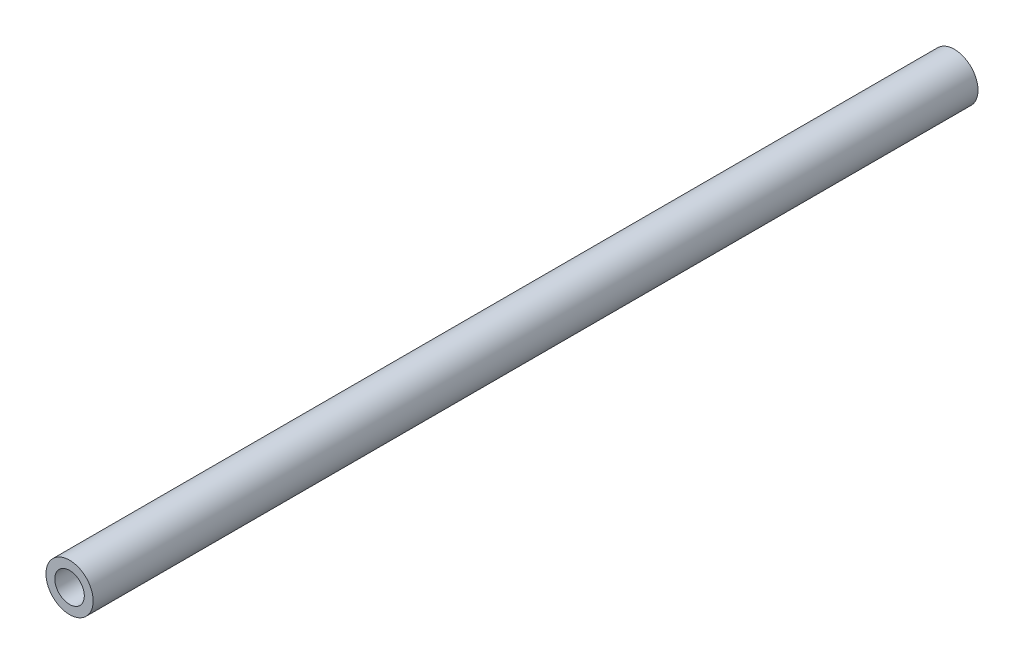
ISO-10303-21;
HEADER;
FILE_DESCRIPTION(('STEP AP214'),'2;1');
FILE_NAME('part.step','',(''),(''),'','','');
FILE_SCHEMA(('AUTOMOTIVE_DESIGN { 1 0 10303 214 1 1 1 1 }'));
ENDSEC;
DATA;
#1=APPLICATION_CONTEXT('core data for automotive mechanical design processes');
#2=APPLICATION_PROTOCOL_DEFINITION('international standard','automotive_design',2000,#1);
#3=PRODUCT_CONTEXT('',#1,'mechanical');
#4=PRODUCT('Part','Part','',(#3));
#5=PRODUCT_RELATED_PRODUCT_CATEGORY('part','',(#4));
#6=PRODUCT_DEFINITION_FORMATION('','',#4);
#7=PRODUCT_DEFINITION_CONTEXT('part definition',#1,'design');
#8=PRODUCT_DEFINITION('design','',#6,#7);
#9=PRODUCT_DEFINITION_SHAPE('','',#8);
#10=(LENGTH_UNIT() NAMED_UNIT(*) SI_UNIT(.MILLI.,.METRE.));
#11=(NAMED_UNIT(*) PLANE_ANGLE_UNIT() SI_UNIT($,.RADIAN.));
#12=(NAMED_UNIT(*) SI_UNIT($,.STERADIAN.) SOLID_ANGLE_UNIT());
#13=UNCERTAINTY_MEASURE_WITH_UNIT(LENGTH_MEASURE(1.E-05),#10,'distance_accuracy_value','');
#14=(GEOMETRIC_REPRESENTATION_CONTEXT(3) GLOBAL_UNCERTAINTY_ASSIGNED_CONTEXT((#13)) GLOBAL_UNIT_ASSIGNED_CONTEXT((#10,
#11,#12)) REPRESENTATION_CONTEXT('',''));
#15=CARTESIAN_POINT('',(0.,0.,0.));
#16=DIRECTION('',(0.,0.,1.));
#17=DIRECTION('',(1.,0.,0.));
#18=AXIS2_PLACEMENT_3D('',#15,#16,#17);
#19=CARTESIAN_POINT('',(0.,0.,-150.));
#20=DIRECTION('',(0.,0.,1.));
#21=DIRECTION('',(-1.,0.,0.));
#22=AXIS2_PLACEMENT_3D('',#19,#20,#21);
#23=CYLINDRICAL_SURFACE('',#22,4.);
#24=CARTESIAN_POINT('',(0.,0.,-149.));
#25=DIRECTION('',(0.,0.,1.));
#26=DIRECTION('',(1.,0.,0.));
#27=AXIS2_PLACEMENT_3D('',#24,#25,#26);
#28=CIRCLE('',#27,4.);
#29=CARTESIAN_POINT('',(4.,0.,-149.));
#30=VERTEX_POINT('',#29);
#31=EDGE_CURVE('E40',#30,#30,#28,.T.);
#32=ORIENTED_EDGE('',*,*,#31,.F.);
#33=EDGE_LOOP('',(#32));
#34=FACE_BOUND('',#33,.T.);
#35=CARTESIAN_POINT('',(0.,0.,120.));
#36=DIRECTION('',(0.,0.,-1.));
#37=DIRECTION('',(-1.,0.,0.));
#38=AXIS2_PLACEMENT_3D('',#35,#36,#37);
#39=CIRCLE('',#38,4.);
#40=CARTESIAN_POINT('',(-4.,0.,120.));
#41=VERTEX_POINT('',#40);
#42=EDGE_CURVE('E51',#41,#41,#39,.T.);
#43=ORIENTED_EDGE('',*,*,#42,.F.);
#44=EDGE_LOOP('',(#43));
#45=FACE_BOUND('',#44,.T.);
#46=ADVANCED_FACE('F33',(#34,#45),#23,.F.);
#47=CARTESIAN_POINT('',(0.,0.,-150.));
#48=DIRECTION('',(0.,0.,-1.));
#49=DIRECTION('',(1.,0.,0.));
#50=AXIS2_PLACEMENT_3D('',#47,#48,#49);
#51=PLANE('',#50);
#52=CARTESIAN_POINT('',(0.,0.,-150.));
#53=DIRECTION('',(0.,0.,1.));
#54=DIRECTION('',(1.,0.,0.));
#55=AXIS2_PLACEMENT_3D('',#52,#53,#54);
#56=CIRCLE('',#55,5.);
#57=CARTESIAN_POINT('',(5.,0.,-150.));
#58=VERTEX_POINT('',#57);
#59=EDGE_CURVE('E10',#58,#58,#56,.F.);
#60=ORIENTED_EDGE('',*,*,#59,.F.);
#61=EDGE_LOOP('',(#60));
#62=FACE_BOUND('',#61,.T.);
#63=CARTESIAN_POINT('',(0.,0.,-150.));
#64=DIRECTION('',(0.,0.,1.));
#65=DIRECTION('',(1.,0.,0.));
#66=AXIS2_PLACEMENT_3D('',#63,#64,#65);
#67=CIRCLE('',#66,8.);
#68=CARTESIAN_POINT('',(8.,0.,-150.));
#69=VERTEX_POINT('',#68);
#70=EDGE_CURVE('E44',#69,#69,#67,.T.);
#71=ORIENTED_EDGE('',*,*,#70,.F.);
#72=EDGE_LOOP('',(#71));
#73=FACE_BOUND('',#72,.T.);
#74=ADVANCED_FACE('F77',(#62,#73),#51,.T.);
#75=CARTESIAN_POINT('',(0.,0.,150.));
#76=DIRECTION('',(0.,0.,-1.));
#77=DIRECTION('',(1.,0.,0.));
#78=AXIS2_PLACEMENT_3D('',#75,#76,#77);
#79=PLANE('',#78);
#80=CARTESIAN_POINT('',(0.,0.,150.));
#81=DIRECTION('',(0.,0.,-1.));
#82=DIRECTION('',(-1.,0.,0.));
#83=AXIS2_PLACEMENT_3D('',#80,#81,#82);
#84=CIRCLE('',#83,5.);
#85=CARTESIAN_POINT('',(-5.,0.,150.));
#86=VERTEX_POINT('',#85);
#87=EDGE_CURVE('E57',#86,#86,#84,.T.);
#88=ORIENTED_EDGE('',*,*,#87,.T.);
#89=EDGE_LOOP('',(#88));
#90=FACE_BOUND('',#89,.T.);
#91=CARTESIAN_POINT('',(0.,0.,150.));
#92=DIRECTION('',(0.,0.,1.));
#93=DIRECTION('',(1.,0.,0.));
#94=AXIS2_PLACEMENT_3D('',#91,#92,#93);
#95=CIRCLE('',#94,8.);
#96=CARTESIAN_POINT('',(8.,0.,150.));
#97=VERTEX_POINT('',#96);
#98=EDGE_CURVE('E48',#97,#97,#95,.T.);
#99=ORIENTED_EDGE('',*,*,#98,.T.);
#100=EDGE_LOOP('',(#99));
#101=FACE_BOUND('',#100,.T.);
#102=ADVANCED_FACE('F83',(#90,#101),#79,.F.);
#103=CARTESIAN_POINT('',(0.,0.,-150.));
#104=DIRECTION('',(0.,0.,1.));
#105=DIRECTION('',(-1.,0.,0.));
#106=AXIS2_PLACEMENT_3D('',#103,#104,#105);
#107=CYLINDRICAL_SURFACE('',#106,8.);
#108=ORIENTED_EDGE('',*,*,#70,.T.);
#109=EDGE_LOOP('',(#108));
#110=FACE_BOUND('',#109,.T.);
#111=ORIENTED_EDGE('',*,*,#98,.F.);
#112=EDGE_LOOP('',(#111));
#113=FACE_BOUND('',#112,.T.);
#114=ADVANCED_FACE('F74',(#110,#113),#107,.T.);
#115=CARTESIAN_POINT('',(0.,0.,120.));
#116=DIRECTION('',(0.,0.,1.));
#117=DIRECTION('',(-1.,0.,0.));
#118=AXIS2_PLACEMENT_3D('',#115,#116,#117);
#119=CYLINDRICAL_SURFACE('',#118,5.);
#120=CARTESIAN_POINT('',(0.,0.,120.));
#121=DIRECTION('',(0.,0.,-1.));
#122=DIRECTION('',(-1.,0.,0.));
#123=AXIS2_PLACEMENT_3D('',#120,#121,#122);
#124=CIRCLE('',#123,5.);
#125=CARTESIAN_POINT('',(-5.,0.,120.));
#126=VERTEX_POINT('',#125);
#127=EDGE_CURVE('E54',#126,#126,#124,.T.);
#128=ORIENTED_EDGE('',*,*,#127,.T.);
#129=EDGE_LOOP('',(#128));
#130=FACE_BOUND('',#129,.T.);
#131=ORIENTED_EDGE('',*,*,#87,.F.);
#132=EDGE_LOOP('',(#131));
#133=FACE_BOUND('',#132,.T.);
#134=ADVANCED_FACE('F63',(#130,#133),#119,.F.);
#135=CARTESIAN_POINT('',(0.,0.,120.));
#136=DIRECTION('',(0.,0.,1.));
#137=DIRECTION('',(-1.,0.,0.));
#138=AXIS2_PLACEMENT_3D('',#135,#136,#137);
#139=PLANE('',#138);
#140=ORIENTED_EDGE('',*,*,#42,.T.);
#141=EDGE_LOOP('',(#140));
#142=FACE_BOUND('',#141,.T.);
#143=ORIENTED_EDGE('',*,*,#127,.F.);
#144=EDGE_LOOP('',(#143));
#145=FACE_BOUND('',#144,.T.);
#146=ADVANCED_FACE('F66',(#142,#145),#139,.T.);
#147=CARTESIAN_POINT('',(0.,0.,-149.));
#148=DIRECTION('',(0.,0.,-1.));
#149=DIRECTION('',(1.,0.,0.));
#150=AXIS2_PLACEMENT_3D('',#147,#148,#149);
#151=CONICAL_SURFACE('',#150,4.,0.785398163397436);
#152=ORIENTED_EDGE('',*,*,#59,.T.);
#153=EDGE_LOOP('',(#152));
#154=FACE_BOUND('',#153,.T.);
#155=ORIENTED_EDGE('',*,*,#31,.T.);
#156=EDGE_LOOP('',(#155));
#157=FACE_BOUND('',#156,.T.);
#158=ADVANCED_FACE('F35',(#154,#157),#151,.F.);
#159=CLOSED_SHELL('',(#46,#74,#102,#114,#134,#146,#158));
#160=MANIFOLD_SOLID_BREP('B2',#159);
#161=ADVANCED_BREP_SHAPE_REPRESENTATION('',(#18,#160),#14);
#162=SHAPE_DEFINITION_REPRESENTATION(#9,#161);
ENDSEC;
END-ISO-10303-21;
